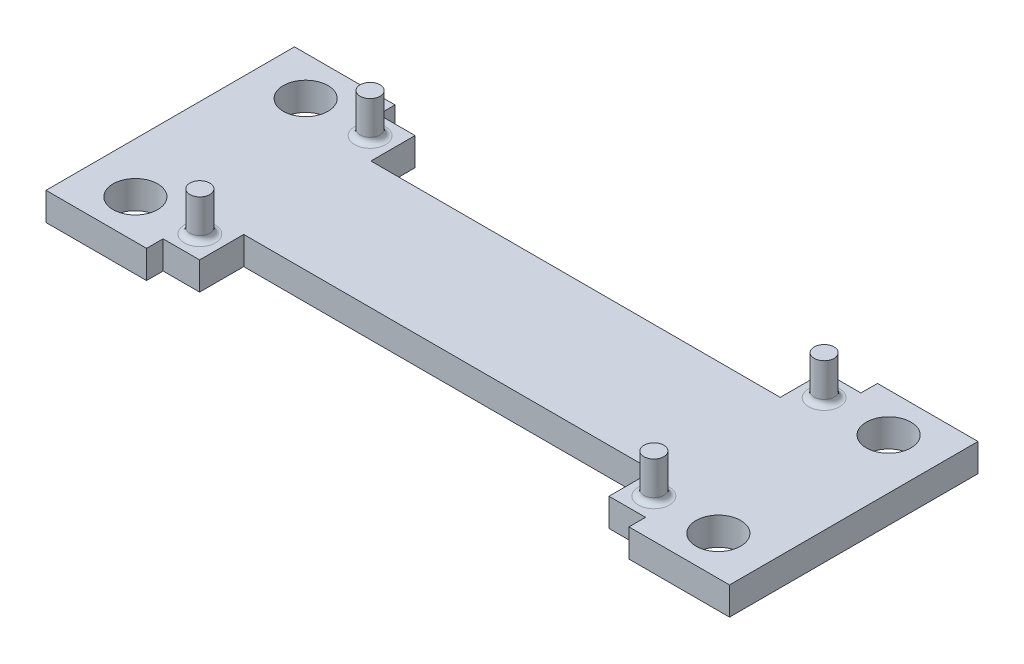
ISO-10303-21;
HEADER;
FILE_DESCRIPTION(('STEP AP214'),'2;1');
FILE_NAME('part.step','',(''),(''),'','','');
FILE_SCHEMA(('AUTOMOTIVE_DESIGN { 1 0 10303 214 1 1 1 1 }'));
ENDSEC;
DATA;
#1=APPLICATION_CONTEXT('core data for automotive mechanical design processes');
#2=APPLICATION_PROTOCOL_DEFINITION('international standard','automotive_design',2000,#1);
#3=PRODUCT_CONTEXT('',#1,'mechanical');
#4=PRODUCT('Part','Part','',(#3));
#5=PRODUCT_RELATED_PRODUCT_CATEGORY('part','',(#4));
#6=PRODUCT_DEFINITION_FORMATION('','',#4);
#7=PRODUCT_DEFINITION_CONTEXT('part definition',#1,'design');
#8=PRODUCT_DEFINITION('design','',#6,#7);
#9=PRODUCT_DEFINITION_SHAPE('','',#8);
#10=(LENGTH_UNIT() NAMED_UNIT(*) SI_UNIT(.MILLI.,.METRE.));
#11=(NAMED_UNIT(*) PLANE_ANGLE_UNIT() SI_UNIT($,.RADIAN.));
#12=(NAMED_UNIT(*) SI_UNIT($,.STERADIAN.) SOLID_ANGLE_UNIT());
#13=UNCERTAINTY_MEASURE_WITH_UNIT(LENGTH_MEASURE(1.E-05),#10,'distance_accuracy_value','');
#14=(GEOMETRIC_REPRESENTATION_CONTEXT(3) GLOBAL_UNCERTAINTY_ASSIGNED_CONTEXT((#13)) GLOBAL_UNIT_ASSIGNED_CONTEXT((#10,
#11,#12)) REPRESENTATION_CONTEXT('',''));
#15=CARTESIAN_POINT('',(0.,0.,0.));
#16=DIRECTION('',(0.,0.,1.));
#17=DIRECTION('',(1.,0.,0.));
#18=AXIS2_PLACEMENT_3D('',#15,#16,#17);
#19=CARTESIAN_POINT('',(0.,2.5,0.749999999999999));
#20=DIRECTION('',(0.,0.,-1.));
#21=DIRECTION('',(-1.,0.,0.));
#22=AXIS2_PLACEMENT_3D('',#19,#20,#21);
#23=PLANE('',#22);
#24=DIRECTION('',(1.,0.,0.));
#25=VECTOR('',#24,1.);
#26=CARTESIAN_POINT('',(0.,0.,0.749999999999999));
#27=LINE('',#26,#25);
#28=CARTESIAN_POINT('',(39.91,0.,0.75));
#29=VERTEX_POINT('',#28);
#30=CARTESIAN_POINT('',(43.18,0.,0.75));
#31=VERTEX_POINT('',#30);
#32=EDGE_CURVE('E219',#29,#31,#27,.T.);
#33=ORIENTED_EDGE('',*,*,#32,.T.);
#34=DIRECTION('',(0.,-1.,0.));
#35=VECTOR('',#34,1.);
#36=CARTESIAN_POINT('',(43.18,2.5,0.75));
#37=LINE('',#36,#35);
#38=CARTESIAN_POINT('',(43.18,2.5,0.75));
#39=VERTEX_POINT('',#38);
#40=EDGE_CURVE('E318',#39,#31,#37,.T.);
#41=ORIENTED_EDGE('',*,*,#40,.F.);
#42=DIRECTION('',(1.,0.,0.));
#43=VECTOR('',#42,1.);
#44=CARTESIAN_POINT('',(0.,2.5,0.749999999999999));
#45=LINE('',#44,#43);
#46=CARTESIAN_POINT('',(39.91,2.5,0.75));
#47=VERTEX_POINT('',#46);
#48=EDGE_CURVE('E282',#47,#39,#45,.T.);
#49=ORIENTED_EDGE('',*,*,#48,.F.);
#50=DIRECTION('',(0.,-1.,0.));
#51=VECTOR('',#50,1.);
#52=CARTESIAN_POINT('',(39.91,2.5,0.75));
#53=LINE('',#52,#51);
#54=EDGE_CURVE('E52',#47,#29,#53,.T.);
#55=ORIENTED_EDGE('',*,*,#54,.T.);
#56=EDGE_LOOP('',(#33,#41,#49,#55));
#57=FACE_BOUND('',#56,.T.);
#58=ADVANCED_FACE('F35',(#57),#23,.F.);
#59=CARTESIAN_POINT('',(43.18,2.5,0.));
#60=DIRECTION('',(1.,0.,0.));
#61=DIRECTION('',(0.,0.,-1.));
#62=AXIS2_PLACEMENT_3D('',#59,#60,#61);
#63=PLANE('',#62);
#64=DIRECTION('',(0.,0.,1.));
#65=VECTOR('',#64,1.);
#66=CARTESIAN_POINT('',(43.18,0.,0.));
#67=LINE('',#66,#65);
#68=CARTESIAN_POINT('',(43.18,0.,2.23));
#69=VERTEX_POINT('',#68);
#70=EDGE_CURVE('E221',#31,#69,#67,.T.);
#71=ORIENTED_EDGE('',*,*,#70,.T.);
#72=DIRECTION('',(0.,-1.,0.));
#73=VECTOR('',#72,1.);
#74=CARTESIAN_POINT('',(43.18,2.5,2.23));
#75=LINE('',#74,#73);
#76=CARTESIAN_POINT('',(43.18,2.5,2.23));
#77=VERTEX_POINT('',#76);
#78=EDGE_CURVE('E315',#77,#69,#75,.T.);
#79=ORIENTED_EDGE('',*,*,#78,.F.);
#80=DIRECTION('',(0.,0.,1.));
#81=VECTOR('',#80,1.);
#82=CARTESIAN_POINT('',(43.18,2.5,0.));
#83=LINE('',#82,#81);
#84=EDGE_CURVE('E128',#39,#77,#83,.T.);
#85=ORIENTED_EDGE('',*,*,#84,.F.);
#86=ORIENTED_EDGE('',*,*,#40,.T.);
#87=EDGE_LOOP('',(#71,#79,#85,#86));
#88=FACE_BOUND('',#87,.T.);
#89=ADVANCED_FACE('F357',(#88),#63,.F.);
#90=CARTESIAN_POINT('',(0.,2.5,2.23));
#91=DIRECTION('',(0.,0.,-1.));
#92=DIRECTION('',(-1.,0.,0.));
#93=AXIS2_PLACEMENT_3D('',#90,#91,#92);
#94=PLANE('',#93);
#95=DIRECTION('',(1.,0.,0.));
#96=VECTOR('',#95,1.);
#97=CARTESIAN_POINT('',(0.,0.,2.23));
#98=LINE('',#97,#96);
#99=CARTESIAN_POINT('',(52.18,0.,2.23));
#100=VERTEX_POINT('',#99);
#101=EDGE_CURVE('E224',#69,#100,#98,.T.);
#102=ORIENTED_EDGE('',*,*,#101,.T.);
#103=DIRECTION('',(0.,-1.,0.));
#104=VECTOR('',#103,1.);
#105=CARTESIAN_POINT('',(52.18,2.5,2.23));
#106=LINE('',#105,#104);
#107=CARTESIAN_POINT('',(52.18,2.5,2.23));
#108=VERTEX_POINT('',#107);
#109=EDGE_CURVE('E313',#108,#100,#106,.T.);
#110=ORIENTED_EDGE('',*,*,#109,.F.);
#111=DIRECTION('',(1.,0.,0.));
#112=VECTOR('',#111,1.);
#113=CARTESIAN_POINT('',(0.,2.5,2.23));
#114=LINE('',#113,#112);
#115=EDGE_CURVE('E400',#77,#108,#114,.T.);
#116=ORIENTED_EDGE('',*,*,#115,.F.);
#117=ORIENTED_EDGE('',*,*,#78,.T.);
#118=EDGE_LOOP('',(#102,#110,#116,#117));
#119=FACE_BOUND('',#118,.T.);
#120=ADVANCED_FACE('F362',(#119),#94,.F.);
#121=CARTESIAN_POINT('',(52.18,2.5,0.));
#122=DIRECTION('',(1.,0.,0.));
#123=DIRECTION('',(0.,0.,-1.));
#124=AXIS2_PLACEMENT_3D('',#121,#122,#123);
#125=PLANE('',#124);
#126=DIRECTION('',(0.,0.,1.));
#127=VECTOR('',#126,1.);
#128=CARTESIAN_POINT('',(52.18,0.,0.));
#129=LINE('',#128,#127);
#130=CARTESIAN_POINT('',(52.18,0.,-20.01));
#131=VERTEX_POINT('',#130);
#132=EDGE_CURVE('E228',#131,#100,#129,.T.);
#133=ORIENTED_EDGE('',*,*,#132,.F.);
#134=DIRECTION('',(0.,-1.,0.));
#135=VECTOR('',#134,1.);
#136=CARTESIAN_POINT('',(52.18,2.5,-20.01));
#137=LINE('',#136,#135);
#138=CARTESIAN_POINT('',(52.18,2.5,-20.01));
#139=VERTEX_POINT('',#138);
#140=EDGE_CURVE('E311',#139,#131,#137,.T.);
#141=ORIENTED_EDGE('',*,*,#140,.F.);
#142=DIRECTION('',(0.,0.,1.));
#143=VECTOR('',#142,1.);
#144=CARTESIAN_POINT('',(52.18,2.5,0.));
#145=LINE('',#144,#143);
#146=EDGE_CURVE('E403',#139,#108,#145,.T.);
#147=ORIENTED_EDGE('',*,*,#146,.T.);
#148=ORIENTED_EDGE('',*,*,#109,.T.);
#149=EDGE_LOOP('',(#133,#141,#147,#148));
#150=FACE_BOUND('',#149,.T.);
#151=ADVANCED_FACE('F495',(#150),#125,.T.);
#152=CARTESIAN_POINT('',(0.,2.5,-20.01));
#153=DIRECTION('',(0.,0.,-1.));
#154=DIRECTION('',(-1.,0.,0.));
#155=AXIS2_PLACEMENT_3D('',#152,#153,#154);
#156=PLANE('',#155);
#157=DIRECTION('',(1.,0.,0.));
#158=VECTOR('',#157,1.);
#159=CARTESIAN_POINT('',(0.,0.,-20.01));
#160=LINE('',#159,#158);
#161=CARTESIAN_POINT('',(43.18,0.,-20.01));
#162=VERTEX_POINT('',#161);
#163=EDGE_CURVE('E231',#162,#131,#160,.T.);
#164=ORIENTED_EDGE('',*,*,#163,.F.);
#165=DIRECTION('',(0.,-1.,0.));
#166=VECTOR('',#165,1.);
#167=CARTESIAN_POINT('',(43.18,2.5,-20.01));
#168=LINE('',#167,#166);
#169=CARTESIAN_POINT('',(43.18,2.5,-20.01));
#170=VERTEX_POINT('',#169);
#171=EDGE_CURVE('E309',#170,#162,#168,.T.);
#172=ORIENTED_EDGE('',*,*,#171,.F.);
#173=DIRECTION('',(1.,0.,0.));
#174=VECTOR('',#173,1.);
#175=CARTESIAN_POINT('',(0.,2.5,-20.01));
#176=LINE('',#175,#174);
#177=EDGE_CURVE('E406',#170,#139,#176,.T.);
#178=ORIENTED_EDGE('',*,*,#177,.T.);
#179=ORIENTED_EDGE('',*,*,#140,.T.);
#180=EDGE_LOOP('',(#164,#172,#178,#179));
#181=FACE_BOUND('',#180,.T.);
#182=ADVANCED_FACE('F492',(#181),#156,.T.);
#183=CARTESIAN_POINT('',(43.18,0.,-18.53));
#184=VERTEX_POINT('',#183);
#185=EDGE_CURVE('E225',#162,#184,#67,.T.);
#186=ORIENTED_EDGE('',*,*,#185,.T.);
#187=DIRECTION('',(0.,-1.,0.));
#188=VECTOR('',#187,1.);
#189=CARTESIAN_POINT('',(43.18,2.5,-18.53));
#190=LINE('',#189,#188);
#191=CARTESIAN_POINT('',(43.18,2.5,-18.53));
#192=VERTEX_POINT('',#191);
#193=EDGE_CURVE('E307',#192,#184,#190,.T.);
#194=ORIENTED_EDGE('',*,*,#193,.F.);
#195=EDGE_CURVE('E401',#170,#192,#83,.T.);
#196=ORIENTED_EDGE('',*,*,#195,.F.);
#197=ORIENTED_EDGE('',*,*,#171,.T.);
#198=EDGE_LOOP('',(#186,#194,#196,#197));
#199=FACE_BOUND('',#198,.T.);
#200=ADVANCED_FACE('F364',(#199),#63,.F.);
#201=CARTESIAN_POINT('',(0.,2.5,-18.53));
#202=DIRECTION('',(0.,0.,-1.));
#203=DIRECTION('',(-1.,0.,0.));
#204=AXIS2_PLACEMENT_3D('',#201,#202,#203);
#205=PLANE('',#204);
#206=DIRECTION('',(1.,0.,0.));
#207=VECTOR('',#206,1.);
#208=CARTESIAN_POINT('',(0.,0.,-18.53));
#209=LINE('',#208,#207);
#210=CARTESIAN_POINT('',(39.91,0.,-18.53));
#211=VERTEX_POINT('',#210);
#212=EDGE_CURVE('E234',#211,#184,#209,.T.);
#213=ORIENTED_EDGE('',*,*,#212,.F.);
#214=DIRECTION('',(0.,-1.,0.));
#215=VECTOR('',#214,1.);
#216=CARTESIAN_POINT('',(39.91,2.5,-18.53));
#217=LINE('',#216,#215);
#218=CARTESIAN_POINT('',(39.91,2.5,-18.53));
#219=VERTEX_POINT('',#218);
#220=EDGE_CURVE('E305',#219,#211,#217,.T.);
#221=ORIENTED_EDGE('',*,*,#220,.F.);
#222=DIRECTION('',(1.,0.,0.));
#223=VECTOR('',#222,1.);
#224=CARTESIAN_POINT('',(0.,2.5,-18.53));
#225=LINE('',#224,#223);
#226=EDGE_CURVE('E409',#219,#192,#225,.T.);
#227=ORIENTED_EDGE('',*,*,#226,.T.);
#228=ORIENTED_EDGE('',*,*,#193,.T.);
#229=EDGE_LOOP('',(#213,#221,#227,#228));
#230=FACE_BOUND('',#229,.T.);
#231=ADVANCED_FACE('F486',(#230),#205,.T.);
#232=CARTESIAN_POINT('',(39.91,2.5,0.));
#233=DIRECTION('',(1.,0.,0.));
#234=DIRECTION('',(0.,0.,-1.));
#235=AXIS2_PLACEMENT_3D('',#232,#233,#234);
#236=PLANE('',#235);
#237=DIRECTION('',(0.,0.,1.));
#238=VECTOR('',#237,1.);
#239=CARTESIAN_POINT('',(39.91,0.,0.));
#240=LINE('',#239,#238);
#241=CARTESIAN_POINT('',(39.91,0.,-14.58));
#242=VERTEX_POINT('',#241);
#243=EDGE_CURVE('E237',#211,#242,#240,.T.);
#244=ORIENTED_EDGE('',*,*,#243,.T.);
#245=DIRECTION('',(0.,-1.,0.));
#246=VECTOR('',#245,1.);
#247=CARTESIAN_POINT('',(39.91,2.5,-14.58));
#248=LINE('',#247,#246);
#249=CARTESIAN_POINT('',(39.91,2.5,-14.58));
#250=VERTEX_POINT('',#249);
#251=EDGE_CURVE('E303',#250,#242,#248,.T.);
#252=ORIENTED_EDGE('',*,*,#251,.F.);
#253=DIRECTION('',(0.,0.,1.));
#254=VECTOR('',#253,1.);
#255=CARTESIAN_POINT('',(39.91,2.5,0.));
#256=LINE('',#255,#254);
#257=EDGE_CURVE('E412',#219,#250,#256,.T.);
#258=ORIENTED_EDGE('',*,*,#257,.F.);
#259=ORIENTED_EDGE('',*,*,#220,.T.);
#260=EDGE_LOOP('',(#244,#252,#258,#259));
#261=FACE_BOUND('',#260,.T.);
#262=ADVANCED_FACE('F482',(#261),#236,.F.);
#263=CARTESIAN_POINT('',(0.,2.5,-14.58));
#264=DIRECTION('',(0.,0.,-1.));
#265=DIRECTION('',(-1.,0.,0.));
#266=AXIS2_PLACEMENT_3D('',#263,#264,#265);
#267=PLANE('',#266);
#268=DIRECTION('',(1.,0.,0.));
#269=VECTOR('',#268,1.);
#270=CARTESIAN_POINT('',(0.,0.,-14.58));
#271=LINE('',#270,#269);
#272=CARTESIAN_POINT('',(3.27,0.,-14.58));
#273=VERTEX_POINT('',#272);
#274=EDGE_CURVE('E240',#273,#242,#271,.T.);
#275=ORIENTED_EDGE('',*,*,#274,.F.);
#276=DIRECTION('',(0.,-1.,0.));
#277=VECTOR('',#276,1.);
#278=CARTESIAN_POINT('',(3.27,2.5,-14.58));
#279=LINE('',#278,#277);
#280=CARTESIAN_POINT('',(3.27,2.5,-14.58));
#281=VERTEX_POINT('',#280);
#282=EDGE_CURVE('E301',#281,#273,#279,.T.);
#283=ORIENTED_EDGE('',*,*,#282,.F.);
#284=DIRECTION('',(1.,0.,0.));
#285=VECTOR('',#284,1.);
#286=CARTESIAN_POINT('',(0.,2.5,-14.58));
#287=LINE('',#286,#285);
#288=EDGE_CURVE('E414',#281,#250,#287,.T.);
#289=ORIENTED_EDGE('',*,*,#288,.T.);
#290=ORIENTED_EDGE('',*,*,#251,.T.);
#291=EDGE_LOOP('',(#275,#283,#289,#290));
#292=FACE_BOUND('',#291,.T.);
#293=ADVANCED_FACE('F478',(#292),#267,.T.);
#294=CARTESIAN_POINT('',(3.27,2.5,0.));
#295=DIRECTION('',(1.,0.,0.));
#296=DIRECTION('',(0.,0.,-1.));
#297=AXIS2_PLACEMENT_3D('',#294,#295,#296);
#298=PLANE('',#297);
#299=DIRECTION('',(0.,0.,1.));
#300=VECTOR('',#299,1.);
#301=CARTESIAN_POINT('',(3.27,0.,0.));
#302=LINE('',#301,#300);
#303=CARTESIAN_POINT('',(3.27,0.,-18.53));
#304=VERTEX_POINT('',#303);
#305=EDGE_CURVE('E243',#304,#273,#302,.T.);
#306=ORIENTED_EDGE('',*,*,#305,.F.);
#307=DIRECTION('',(0.,-1.,0.));
#308=VECTOR('',#307,1.);
#309=CARTESIAN_POINT('',(3.27,2.5,-18.53));
#310=LINE('',#309,#308);
#311=CARTESIAN_POINT('',(3.27,2.5,-18.53));
#312=VERTEX_POINT('',#311);
#313=EDGE_CURVE('E299',#312,#304,#310,.T.);
#314=ORIENTED_EDGE('',*,*,#313,.F.);
#315=DIRECTION('',(0.,0.,1.));
#316=VECTOR('',#315,1.);
#317=CARTESIAN_POINT('',(3.27,2.5,0.));
#318=LINE('',#317,#316);
#319=EDGE_CURVE('E417',#312,#281,#318,.T.);
#320=ORIENTED_EDGE('',*,*,#319,.T.);
#321=ORIENTED_EDGE('',*,*,#282,.T.);
#322=EDGE_LOOP('',(#306,#314,#320,#321));
#323=FACE_BOUND('',#322,.T.);
#324=ADVANCED_FACE('F474',(#323),#298,.T.);
#325=CARTESIAN_POINT('',(0.,2.5,-18.53));
#326=DIRECTION('',(0.,0.,1.));
#327=DIRECTION('',(1.,0.,0.));
#328=AXIS2_PLACEMENT_3D('',#325,#326,#327);
#329=PLANE('',#328);
#330=DIRECTION('',(-1.,0.,0.));
#331=VECTOR('',#330,1.);
#332=CARTESIAN_POINT('',(0.,0.,-18.53));
#333=LINE('',#332,#331);
#334=CARTESIAN_POINT('',(0.,0.,-18.53));
#335=VERTEX_POINT('',#334);
#336=EDGE_CURVE('E246',#304,#335,#333,.T.);
#337=ORIENTED_EDGE('',*,*,#336,.T.);
#338=DIRECTION('',(0.,-1.,0.));
#339=VECTOR('',#338,1.);
#340=CARTESIAN_POINT('',(0.,2.5,-18.53));
#341=LINE('',#340,#339);
#342=CARTESIAN_POINT('',(0.,2.5,-18.53));
#343=VERTEX_POINT('',#342);
#344=EDGE_CURVE('E297',#343,#335,#341,.T.);
#345=ORIENTED_EDGE('',*,*,#344,.F.);
#346=DIRECTION('',(-1.,0.,0.));
#347=VECTOR('',#346,1.);
#348=CARTESIAN_POINT('',(0.,2.5,-18.53));
#349=LINE('',#348,#347);
#350=EDGE_CURVE('E420',#312,#343,#349,.T.);
#351=ORIENTED_EDGE('',*,*,#350,.F.);
#352=ORIENTED_EDGE('',*,*,#313,.T.);
#353=EDGE_LOOP('',(#337,#345,#351,#352));
#354=FACE_BOUND('',#353,.T.);
#355=ADVANCED_FACE('F471',(#354),#329,.F.);
#356=CARTESIAN_POINT('',(0.,2.5,0.));
#357=DIRECTION('',(1.,0.,0.));
#358=DIRECTION('',(0.,0.,-1.));
#359=AXIS2_PLACEMENT_3D('',#356,#357,#358);
#360=PLANE('',#359);
#361=DIRECTION('',(0.,0.,1.));
#362=VECTOR('',#361,1.);
#363=CARTESIAN_POINT('',(0.,0.,0.));
#364=LINE('',#363,#362);
#365=CARTESIAN_POINT('',(0.,0.,-20.01));
#366=VERTEX_POINT('',#365);
#367=EDGE_CURVE('E249',#366,#335,#364,.T.);
#368=ORIENTED_EDGE('',*,*,#367,.F.);
#369=DIRECTION('',(0.,-1.,0.));
#370=VECTOR('',#369,1.);
#371=CARTESIAN_POINT('',(0.,2.5,-20.01));
#372=LINE('',#371,#370);
#373=CARTESIAN_POINT('',(0.,2.5,-20.01));
#374=VERTEX_POINT('',#373);
#375=EDGE_CURVE('E295',#374,#366,#372,.T.);
#376=ORIENTED_EDGE('',*,*,#375,.F.);
#377=DIRECTION('',(0.,0.,1.));
#378=VECTOR('',#377,1.);
#379=CARTESIAN_POINT('',(0.,2.5,0.));
#380=LINE('',#379,#378);
#381=EDGE_CURVE('E422',#374,#343,#380,.T.);
#382=ORIENTED_EDGE('',*,*,#381,.T.);
#383=ORIENTED_EDGE('',*,*,#344,.T.);
#384=EDGE_LOOP('',(#368,#376,#382,#383));
#385=FACE_BOUND('',#384,.T.);
#386=ADVANCED_FACE('F458',(#385),#360,.T.);
#387=CARTESIAN_POINT('',(0.,2.5,-20.01));
#388=DIRECTION('',(0.,0.,1.));
#389=DIRECTION('',(1.,0.,0.));
#390=AXIS2_PLACEMENT_3D('',#387,#388,#389);
#391=PLANE('',#390);
#392=DIRECTION('',(-1.,0.,0.));
#393=VECTOR('',#392,1.);
#394=CARTESIAN_POINT('',(0.,0.,-20.01));
#395=LINE('',#394,#393);
#396=CARTESIAN_POINT('',(-9.,0.,-20.01));
#397=VERTEX_POINT('',#396);
#398=EDGE_CURVE('E252',#366,#397,#395,.T.);
#399=ORIENTED_EDGE('',*,*,#398,.T.);
#400=DIRECTION('',(0.,-1.,0.));
#401=VECTOR('',#400,1.);
#402=CARTESIAN_POINT('',(-9.,2.5,-20.01));
#403=LINE('',#402,#401);
#404=CARTESIAN_POINT('',(-9.,2.5,-20.01));
#405=VERTEX_POINT('',#404);
#406=EDGE_CURVE('E292',#405,#397,#403,.T.);
#407=ORIENTED_EDGE('',*,*,#406,.F.);
#408=DIRECTION('',(-1.,0.,0.));
#409=VECTOR('',#408,1.);
#410=CARTESIAN_POINT('',(0.,2.5,-20.01));
#411=LINE('',#410,#409);
#412=EDGE_CURVE('E425',#374,#405,#411,.T.);
#413=ORIENTED_EDGE('',*,*,#412,.F.);
#414=ORIENTED_EDGE('',*,*,#375,.T.);
#415=EDGE_LOOP('',(#399,#407,#413,#414));
#416=FACE_BOUND('',#415,.T.);
#417=ADVANCED_FACE('F466',(#416),#391,.F.);
#418=CARTESIAN_POINT('',(-9.,2.5,0.));
#419=DIRECTION('',(1.,0.,0.));
#420=DIRECTION('',(0.,0.,-1.));
#421=AXIS2_PLACEMENT_3D('',#418,#419,#420);
#422=PLANE('',#421);
#423=DIRECTION('',(0.,0.,1.));
#424=VECTOR('',#423,1.);
#425=CARTESIAN_POINT('',(-9.,0.,0.));
#426=LINE('',#425,#424);
#427=CARTESIAN_POINT('',(-9.,0.,2.23));
#428=VERTEX_POINT('',#427);
#429=EDGE_CURVE('E255',#397,#428,#426,.T.);
#430=ORIENTED_EDGE('',*,*,#429,.T.);
#431=DIRECTION('',(0.,-1.,0.));
#432=VECTOR('',#431,1.);
#433=CARTESIAN_POINT('',(-9.,2.5,2.23));
#434=LINE('',#433,#432);
#435=CARTESIAN_POINT('',(-9.,2.5,2.23));
#436=VERTEX_POINT('',#435);
#437=EDGE_CURVE('E290',#436,#428,#434,.T.);
#438=ORIENTED_EDGE('',*,*,#437,.F.);
#439=DIRECTION('',(0.,0.,1.));
#440=VECTOR('',#439,1.);
#441=CARTESIAN_POINT('',(-9.,2.5,0.));
#442=LINE('',#441,#440);
#443=EDGE_CURVE('E428',#405,#436,#442,.T.);
#444=ORIENTED_EDGE('',*,*,#443,.F.);
#445=ORIENTED_EDGE('',*,*,#406,.T.);
#446=EDGE_LOOP('',(#430,#438,#444,#445));
#447=FACE_BOUND('',#446,.T.);
#448=ADVANCED_FACE('F463',(#447),#422,.F.);
#449=CARTESIAN_POINT('',(0.,2.5,2.23));
#450=DIRECTION('',(0.,0.,1.));
#451=DIRECTION('',(1.,0.,0.));
#452=AXIS2_PLACEMENT_3D('',#449,#450,#451);
#453=PLANE('',#452);
#454=DIRECTION('',(-1.,0.,0.));
#455=VECTOR('',#454,1.);
#456=CARTESIAN_POINT('',(0.,0.,2.23));
#457=LINE('',#456,#455);
#458=CARTESIAN_POINT('',(0.,0.,2.23));
#459=VERTEX_POINT('',#458);
#460=EDGE_CURVE('E258',#459,#428,#457,.T.);
#461=ORIENTED_EDGE('',*,*,#460,.F.);
#462=DIRECTION('',(0.,-1.,0.));
#463=VECTOR('',#462,1.);
#464=CARTESIAN_POINT('',(0.,2.5,2.23));
#465=LINE('',#464,#463);
#466=CARTESIAN_POINT('',(0.,2.5,2.23));
#467=VERTEX_POINT('',#466);
#468=EDGE_CURVE('E288',#467,#459,#465,.T.);
#469=ORIENTED_EDGE('',*,*,#468,.F.);
#470=DIRECTION('',(-1.,0.,0.));
#471=VECTOR('',#470,1.);
#472=CARTESIAN_POINT('',(0.,2.5,2.23));
#473=LINE('',#472,#471);
#474=EDGE_CURVE('E430',#467,#436,#473,.T.);
#475=ORIENTED_EDGE('',*,*,#474,.T.);
#476=ORIENTED_EDGE('',*,*,#437,.T.);
#477=EDGE_LOOP('',(#461,#469,#475,#476));
#478=FACE_BOUND('',#477,.T.);
#479=ADVANCED_FACE('F442',(#478),#453,.T.);
#480=CARTESIAN_POINT('',(0.,0.,0.75));
#481=VERTEX_POINT('',#480);
#482=EDGE_CURVE('E253',#481,#459,#364,.T.);
#483=ORIENTED_EDGE('',*,*,#482,.F.);
#484=DIRECTION('',(0.,-1.,0.));
#485=VECTOR('',#484,1.);
#486=CARTESIAN_POINT('',(0.,2.5,0.75));
#487=LINE('',#486,#485);
#488=CARTESIAN_POINT('',(0.,2.5,0.75));
#489=VERTEX_POINT('',#488);
#490=EDGE_CURVE('E286',#489,#481,#487,.T.);
#491=ORIENTED_EDGE('',*,*,#490,.F.);
#492=EDGE_CURVE('E426',#489,#467,#380,.T.);
#493=ORIENTED_EDGE('',*,*,#492,.T.);
#494=ORIENTED_EDGE('',*,*,#468,.T.);
#495=EDGE_LOOP('',(#483,#491,#493,#494));
#496=FACE_BOUND('',#495,.T.);
#497=ADVANCED_FACE('F436',(#496),#360,.T.);
#498=CARTESIAN_POINT('',(0.,2.5,0.75));
#499=DIRECTION('',(0.,0.,1.));
#500=DIRECTION('',(1.,0.,0.));
#501=AXIS2_PLACEMENT_3D('',#498,#499,#500);
#502=PLANE('',#501);
#503=DIRECTION('',(-1.,0.,0.));
#504=VECTOR('',#503,1.);
#505=CARTESIAN_POINT('',(0.,0.,0.75));
#506=LINE('',#505,#504);
#507=CARTESIAN_POINT('',(3.27,0.,0.75));
#508=VERTEX_POINT('',#507);
#509=EDGE_CURVE('E261',#508,#481,#506,.T.);
#510=ORIENTED_EDGE('',*,*,#509,.F.);
#511=DIRECTION('',(0.,-1.,0.));
#512=VECTOR('',#511,1.);
#513=CARTESIAN_POINT('',(3.27,2.5,0.75));
#514=LINE('',#513,#512);
#515=CARTESIAN_POINT('',(3.27,2.5,0.75));
#516=VERTEX_POINT('',#515);
#517=EDGE_CURVE('E199',#516,#508,#514,.T.);
#518=ORIENTED_EDGE('',*,*,#517,.F.);
#519=DIRECTION('',(-1.,0.,0.));
#520=VECTOR('',#519,1.);
#521=CARTESIAN_POINT('',(0.,2.5,0.75));
#522=LINE('',#521,#520);
#523=EDGE_CURVE('E189',#516,#489,#522,.T.);
#524=ORIENTED_EDGE('',*,*,#523,.T.);
#525=ORIENTED_EDGE('',*,*,#490,.T.);
#526=EDGE_LOOP('',(#510,#518,#524,#525));
#527=FACE_BOUND('',#526,.T.);
#528=ADVANCED_FACE('F449',(#527),#502,.T.);
#529=CARTESIAN_POINT('',(3.27,2.5,0.));
#530=DIRECTION('',(-1.,0.,0.));
#531=DIRECTION('',(0.,0.,1.));
#532=AXIS2_PLACEMENT_3D('',#529,#530,#531);
#533=PLANE('',#532);
#534=DIRECTION('',(0.,0.,-1.));
#535=VECTOR('',#534,1.);
#536=CARTESIAN_POINT('',(3.27,0.,0.));
#537=LINE('',#536,#535);
#538=CARTESIAN_POINT('',(3.27,0.,-3.2));
#539=VERTEX_POINT('',#538);
#540=EDGE_CURVE('E196',#508,#539,#537,.T.);
#541=ORIENTED_EDGE('',*,*,#540,.T.);
#542=DIRECTION('',(0.,-1.,0.));
#543=VECTOR('',#542,1.);
#544=CARTESIAN_POINT('',(3.27,2.5,-3.2));
#545=LINE('',#544,#543);
#546=CARTESIAN_POINT('',(3.27,2.5,-3.2));
#547=VERTEX_POINT('',#546);
#548=EDGE_CURVE('E193',#547,#539,#545,.T.);
#549=ORIENTED_EDGE('',*,*,#548,.F.);
#550=DIRECTION('',(0.,0.,-1.));
#551=VECTOR('',#550,1.);
#552=CARTESIAN_POINT('',(3.27,2.5,0.));
#553=LINE('',#552,#551);
#554=EDGE_CURVE('E180',#516,#547,#553,.T.);
#555=ORIENTED_EDGE('',*,*,#554,.F.);
#556=ORIENTED_EDGE('',*,*,#517,.T.);
#557=EDGE_LOOP('',(#541,#549,#555,#556));
#558=FACE_BOUND('',#557,.T.);
#559=ADVANCED_FACE('F194',(#558),#533,.F.);
#560=CARTESIAN_POINT('',(0.,2.5,-3.2));
#561=DIRECTION('',(0.,0.,-1.));
#562=DIRECTION('',(-1.,0.,0.));
#563=AXIS2_PLACEMENT_3D('',#560,#561,#562);
#564=PLANE('',#563);
#565=DIRECTION('',(1.,0.,0.));
#566=VECTOR('',#565,1.);
#567=CARTESIAN_POINT('',(0.,0.,-3.2));
#568=LINE('',#567,#566);
#569=CARTESIAN_POINT('',(39.91,0.,-3.2));
#570=VERTEX_POINT('',#569);
#571=EDGE_CURVE('E265',#539,#570,#568,.T.);
#572=ORIENTED_EDGE('',*,*,#571,.T.);
#573=DIRECTION('',(0.,-1.,0.));
#574=VECTOR('',#573,1.);
#575=CARTESIAN_POINT('',(39.91,2.5,-3.2));
#576=LINE('',#575,#574);
#577=CARTESIAN_POINT('',(39.91,2.5,-3.2));
#578=VERTEX_POINT('',#577);
#579=EDGE_CURVE('E115',#578,#570,#576,.T.);
#580=ORIENTED_EDGE('',*,*,#579,.F.);
#581=DIRECTION('',(1.,0.,0.));
#582=VECTOR('',#581,1.);
#583=CARTESIAN_POINT('',(0.,2.5,-3.2));
#584=LINE('',#583,#582);
#585=EDGE_CURVE('E186',#547,#578,#584,.T.);
#586=ORIENTED_EDGE('',*,*,#585,.F.);
#587=ORIENTED_EDGE('',*,*,#548,.T.);
#588=EDGE_LOOP('',(#572,#580,#586,#587));
#589=FACE_BOUND('',#588,.T.);
#590=ADVANCED_FACE('F201',(#589),#564,.F.);
#591=CARTESIAN_POINT('',(47.68,2.5,-16.51));
#592=DIRECTION('',(0.,-1.,0.));
#593=DIRECTION('',(0.,0.,-1.));
#594=AXIS2_PLACEMENT_3D('',#591,#592,#593);
#595=CYLINDRICAL_SURFACE('',#594,2.);
#596=CARTESIAN_POINT('',(47.68,2.5,-16.51));
#597=DIRECTION('',(0.,1.,0.));
#598=DIRECTION('',(0.,0.,1.));
#599=AXIS2_PLACEMENT_3D('',#596,#597,#598);
#600=CIRCLE('',#599,2.);
#601=CARTESIAN_POINT('',(47.68,2.5,-14.51));
#602=VERTEX_POINT('',#601);
#603=EDGE_CURVE('E213',#602,#602,#600,.T.);
#604=ORIENTED_EDGE('',*,*,#603,.T.);
#605=EDGE_LOOP('',(#604));
#606=FACE_BOUND('',#605,.T.);
#607=CARTESIAN_POINT('',(47.68,0.,-16.51));
#608=DIRECTION('',(0.,1.,0.));
#609=DIRECTION('',(0.,0.,1.));
#610=AXIS2_PLACEMENT_3D('',#607,#608,#609);
#611=CIRCLE('',#610,2.);
#612=CARTESIAN_POINT('',(47.68,0.,-14.51));
#613=VERTEX_POINT('',#612);
#614=EDGE_CURVE('E276',#613,#613,#611,.T.);
#615=ORIENTED_EDGE('',*,*,#614,.F.);
#616=EDGE_LOOP('',(#615));
#617=FACE_BOUND('',#616,.T.);
#618=ADVANCED_FACE('F532',(#606,#617),#595,.F.);
#619=CARTESIAN_POINT('',(-4.5,2.5,-16.51));
#620=DIRECTION('',(0.,-1.,0.));
#621=DIRECTION('',(0.,0.,-1.));
#622=AXIS2_PLACEMENT_3D('',#619,#620,#621);
#623=CYLINDRICAL_SURFACE('',#622,2.);
#624=CARTESIAN_POINT('',(-4.5,2.5,-16.51));
#625=DIRECTION('',(0.,1.,0.));
#626=DIRECTION('',(0.,0.,1.));
#627=AXIS2_PLACEMENT_3D('',#624,#625,#626);
#628=CIRCLE('',#627,2.);
#629=CARTESIAN_POINT('',(-4.5,2.5,-14.51));
#630=VERTEX_POINT('',#629);
#631=EDGE_CURVE('E210',#630,#630,#628,.T.);
#632=ORIENTED_EDGE('',*,*,#631,.T.);
#633=EDGE_LOOP('',(#632));
#634=FACE_BOUND('',#633,.T.);
#635=CARTESIAN_POINT('',(-4.5,0.,-16.51));
#636=DIRECTION('',(0.,1.,0.));
#637=DIRECTION('',(0.,0.,1.));
#638=AXIS2_PLACEMENT_3D('',#635,#636,#637);
#639=CIRCLE('',#638,2.);
#640=CARTESIAN_POINT('',(-4.5,0.,-14.51));
#641=VERTEX_POINT('',#640);
#642=EDGE_CURVE('E273',#641,#641,#639,.T.);
#643=ORIENTED_EDGE('',*,*,#642,.F.);
#644=EDGE_LOOP('',(#643));
#645=FACE_BOUND('',#644,.T.);
#646=ADVANCED_FACE('F527',(#634,#645),#623,.F.);
#647=CARTESIAN_POINT('',(-4.5,2.5,-1.27));
#648=DIRECTION('',(0.,-1.,0.));
#649=DIRECTION('',(0.,0.,-1.));
#650=AXIS2_PLACEMENT_3D('',#647,#648,#649);
#651=CYLINDRICAL_SURFACE('',#650,2.);
#652=CARTESIAN_POINT('',(-4.5,2.5,-1.27));
#653=DIRECTION('',(0.,1.,0.));
#654=DIRECTION('',(0.,0.,1.));
#655=AXIS2_PLACEMENT_3D('',#652,#653,#654);
#656=CIRCLE('',#655,2.);
#657=CARTESIAN_POINT('',(-4.5,2.5,0.73));
#658=VERTEX_POINT('',#657);
#659=EDGE_CURVE('E204',#658,#658,#656,.T.);
#660=ORIENTED_EDGE('',*,*,#659,.T.);
#661=EDGE_LOOP('',(#660));
#662=FACE_BOUND('',#661,.T.);
#663=CARTESIAN_POINT('',(-4.5,0.,-1.27));
#664=DIRECTION('',(0.,1.,0.));
#665=DIRECTION('',(0.,0.,1.));
#666=AXIS2_PLACEMENT_3D('',#663,#664,#665);
#667=CIRCLE('',#666,2.);
#668=CARTESIAN_POINT('',(-4.5,0.,0.73));
#669=VERTEX_POINT('',#668);
#670=EDGE_CURVE('E270',#669,#669,#667,.T.);
#671=ORIENTED_EDGE('',*,*,#670,.F.);
#672=EDGE_LOOP('',(#671));
#673=FACE_BOUND('',#672,.T.);
#674=ADVANCED_FACE('F519',(#662,#673),#651,.F.);
#675=CARTESIAN_POINT('',(39.91,2.5,0.));
#676=DIRECTION('',(-1.,0.,0.));
#677=DIRECTION('',(0.,0.,1.));
#678=AXIS2_PLACEMENT_3D('',#675,#676,#677);
#679=PLANE('',#678);
#680=DIRECTION('',(0.,0.,-1.));
#681=VECTOR('',#680,1.);
#682=CARTESIAN_POINT('',(39.91,0.,0.));
#683=LINE('',#682,#681);
#684=EDGE_CURVE('E267',#29,#570,#683,.T.);
#685=ORIENTED_EDGE('',*,*,#684,.F.);
#686=ORIENTED_EDGE('',*,*,#54,.F.);
#687=DIRECTION('',(0.,0.,-1.));
#688=VECTOR('',#687,1.);
#689=CARTESIAN_POINT('',(39.91,2.5,0.));
#690=LINE('',#689,#688);
#691=EDGE_CURVE('E202',#47,#578,#690,.T.);
#692=ORIENTED_EDGE('',*,*,#691,.T.);
#693=ORIENTED_EDGE('',*,*,#579,.T.);
#694=EDGE_LOOP('',(#685,#686,#692,#693));
#695=FACE_BOUND('',#694,.T.);
#696=ADVANCED_FACE('F516',(#695),#679,.T.);
#697=CARTESIAN_POINT('',(47.68,2.5,-1.27));
#698=DIRECTION('',(0.,-1.,0.));
#699=DIRECTION('',(0.,0.,-1.));
#700=AXIS2_PLACEMENT_3D('',#697,#698,#699);
#701=CYLINDRICAL_SURFACE('',#700,2.);
#702=CARTESIAN_POINT('',(47.68,2.5,-1.27));
#703=DIRECTION('',(0.,1.,0.));
#704=DIRECTION('',(0.,0.,1.));
#705=AXIS2_PLACEMENT_3D('',#702,#703,#704);
#706=CIRCLE('',#705,2.);
#707=CARTESIAN_POINT('',(47.68,2.5,0.730000000000003));
#708=VERTEX_POINT('',#707);
#709=EDGE_CURVE('E216',#708,#708,#706,.T.);
#710=ORIENTED_EDGE('',*,*,#709,.T.);
#711=EDGE_LOOP('',(#710));
#712=FACE_BOUND('',#711,.T.);
#713=CARTESIAN_POINT('',(47.68,0.,-1.27));
#714=DIRECTION('',(0.,1.,0.));
#715=DIRECTION('',(0.,0.,1.));
#716=AXIS2_PLACEMENT_3D('',#713,#714,#715);
#717=CIRCLE('',#716,2.);
#718=CARTESIAN_POINT('',(47.68,0.,0.730000000000003));
#719=VERTEX_POINT('',#718);
#720=EDGE_CURVE('E279',#719,#719,#717,.T.);
#721=ORIENTED_EDGE('',*,*,#720,.F.);
#722=EDGE_LOOP('',(#721));
#723=FACE_BOUND('',#722,.T.);
#724=ADVANCED_FACE('F518',(#712,#723),#701,.F.);
#725=CARTESIAN_POINT('',(0.,2.5,0.));
#726=DIRECTION('',(0.,1.,0.));
#727=DIRECTION('',(0.,0.,1.));
#728=AXIS2_PLACEMENT_3D('',#725,#726,#727);
#729=PLANE('',#728);
#730=CARTESIAN_POINT('',(41.91,2.5,-1.27));
#731=DIRECTION('',(0.,1.,0.));
#732=DIRECTION('',(0.,0.,1.));
#733=AXIS2_PLACEMENT_3D('',#730,#731,#732);
#734=CIRCLE('',#733,1.39);
#735=CARTESIAN_POINT('',(41.91,2.5,0.12));
#736=VERTEX_POINT('',#735);
#737=EDGE_CURVE('E332',#736,#736,#734,.F.);
#738=ORIENTED_EDGE('',*,*,#737,.T.);
#739=EDGE_LOOP('',(#738));
#740=FACE_BOUND('',#739,.T.);
#741=CARTESIAN_POINT('',(41.91,2.5,-16.51));
#742=DIRECTION('',(0.,1.,0.));
#743=DIRECTION('',(0.,0.,1.));
#744=AXIS2_PLACEMENT_3D('',#741,#742,#743);
#745=CIRCLE('',#744,1.39);
#746=CARTESIAN_POINT('',(41.91,2.5,-15.12));
#747=VERTEX_POINT('',#746);
#748=EDGE_CURVE('E329',#747,#747,#745,.F.);
#749=ORIENTED_EDGE('',*,*,#748,.T.);
#750=EDGE_LOOP('',(#749));
#751=FACE_BOUND('',#750,.T.);
#752=CARTESIAN_POINT('',(1.27,2.5,-16.51));
#753=DIRECTION('',(0.,1.,0.));
#754=DIRECTION('',(0.,0.,1.));
#755=AXIS2_PLACEMENT_3D('',#752,#753,#754);
#756=CIRCLE('',#755,1.39);
#757=CARTESIAN_POINT('',(1.27,2.5,-15.12));
#758=VERTEX_POINT('',#757);
#759=EDGE_CURVE('E326',#758,#758,#756,.F.);
#760=ORIENTED_EDGE('',*,*,#759,.T.);
#761=EDGE_LOOP('',(#760));
#762=FACE_BOUND('',#761,.T.);
#763=CARTESIAN_POINT('',(1.27,2.5,-1.27));
#764=DIRECTION('',(0.,1.,0.));
#765=DIRECTION('',(0.,0.,1.));
#766=AXIS2_PLACEMENT_3D('',#763,#764,#765);
#767=CIRCLE('',#766,1.39);
#768=CARTESIAN_POINT('',(1.27,2.5,0.12));
#769=VERTEX_POINT('',#768);
#770=EDGE_CURVE('E323',#769,#769,#767,.F.);
#771=ORIENTED_EDGE('',*,*,#770,.T.);
#772=EDGE_LOOP('',(#771));
#773=FACE_BOUND('',#772,.T.);
#774=ORIENTED_EDGE('',*,*,#48,.T.);
#775=ORIENTED_EDGE('',*,*,#84,.T.);
#776=ORIENTED_EDGE('',*,*,#115,.T.);
#777=ORIENTED_EDGE('',*,*,#146,.F.);
#778=ORIENTED_EDGE('',*,*,#177,.F.);
#779=ORIENTED_EDGE('',*,*,#195,.T.);
#780=ORIENTED_EDGE('',*,*,#226,.F.);
#781=ORIENTED_EDGE('',*,*,#257,.T.);
#782=ORIENTED_EDGE('',*,*,#288,.F.);
#783=ORIENTED_EDGE('',*,*,#319,.F.);
#784=ORIENTED_EDGE('',*,*,#350,.T.);
#785=ORIENTED_EDGE('',*,*,#381,.F.);
#786=ORIENTED_EDGE('',*,*,#412,.T.);
#787=ORIENTED_EDGE('',*,*,#443,.T.);
#788=ORIENTED_EDGE('',*,*,#474,.F.);
#789=ORIENTED_EDGE('',*,*,#492,.F.);
#790=ORIENTED_EDGE('',*,*,#523,.F.);
#791=ORIENTED_EDGE('',*,*,#554,.T.);
#792=ORIENTED_EDGE('',*,*,#585,.T.);
#793=ORIENTED_EDGE('',*,*,#691,.F.);
#794=EDGE_LOOP('',(#774,#775,#776,#777,#778,#779,#780,#781,#782,#783,#784,#785,#786,#787,#788,
#789,#790,#791,#792,#793));
#795=FACE_BOUND('',#794,.T.);
#796=ORIENTED_EDGE('',*,*,#659,.F.);
#797=EDGE_LOOP('',(#796));
#798=FACE_BOUND('',#797,.T.);
#799=ORIENTED_EDGE('',*,*,#631,.F.);
#800=EDGE_LOOP('',(#799));
#801=FACE_BOUND('',#800,.T.);
#802=ORIENTED_EDGE('',*,*,#603,.F.);
#803=EDGE_LOOP('',(#802));
#804=FACE_BOUND('',#803,.T.);
#805=ORIENTED_EDGE('',*,*,#709,.F.);
#806=EDGE_LOOP('',(#805));
#807=FACE_BOUND('',#806,.T.);
#808=ADVANCED_FACE('F182',(#740,#751,#762,#773,#795,#798,#801,#804,#807),#729,.T.);
#809=CARTESIAN_POINT('',(0.,0.,0.));
#810=DIRECTION('',(0.,1.,0.));
#811=DIRECTION('',(0.,0.,1.));
#812=AXIS2_PLACEMENT_3D('',#809,#810,#811);
#813=PLANE('',#812);
#814=ORIENTED_EDGE('',*,*,#32,.F.);
#815=ORIENTED_EDGE('',*,*,#684,.T.);
#816=ORIENTED_EDGE('',*,*,#571,.F.);
#817=ORIENTED_EDGE('',*,*,#540,.F.);
#818=ORIENTED_EDGE('',*,*,#509,.T.);
#819=ORIENTED_EDGE('',*,*,#482,.T.);
#820=ORIENTED_EDGE('',*,*,#460,.T.);
#821=ORIENTED_EDGE('',*,*,#429,.F.);
#822=ORIENTED_EDGE('',*,*,#398,.F.);
#823=ORIENTED_EDGE('',*,*,#367,.T.);
#824=ORIENTED_EDGE('',*,*,#336,.F.);
#825=ORIENTED_EDGE('',*,*,#305,.T.);
#826=ORIENTED_EDGE('',*,*,#274,.T.);
#827=ORIENTED_EDGE('',*,*,#243,.F.);
#828=ORIENTED_EDGE('',*,*,#212,.T.);
#829=ORIENTED_EDGE('',*,*,#185,.F.);
#830=ORIENTED_EDGE('',*,*,#163,.T.);
#831=ORIENTED_EDGE('',*,*,#132,.T.);
#832=ORIENTED_EDGE('',*,*,#101,.F.);
#833=ORIENTED_EDGE('',*,*,#70,.F.);
#834=EDGE_LOOP('',(#814,#815,#816,#817,#818,#819,#820,#821,#822,#823,#824,#825,#826,#827,#828,
#829,#830,#831,#832,#833));
#835=FACE_BOUND('',#834,.T.);
#836=ORIENTED_EDGE('',*,*,#670,.T.);
#837=EDGE_LOOP('',(#836));
#838=FACE_BOUND('',#837,.T.);
#839=ORIENTED_EDGE('',*,*,#642,.T.);
#840=EDGE_LOOP('',(#839));
#841=FACE_BOUND('',#840,.T.);
#842=ORIENTED_EDGE('',*,*,#614,.T.);
#843=EDGE_LOOP('',(#842));
#844=FACE_BOUND('',#843,.T.);
#845=ORIENTED_EDGE('',*,*,#720,.T.);
#846=EDGE_LOOP('',(#845));
#847=FACE_BOUND('',#846,.T.);
#848=ADVANCED_FACE('F446',(#835,#838,#841,#844,#847),#813,.F.);
#849=CARTESIAN_POINT('',(1.27,6.,-16.51));
#850=DIRECTION('',(0.,-1.,0.));
#851=DIRECTION('',(0.,0.,-1.));
#852=AXIS2_PLACEMENT_3D('',#849,#850,#851);
#853=CYLINDRICAL_SURFACE('',#852,0.89);
#854=CARTESIAN_POINT('',(1.27,3.,-16.51));
#855=DIRECTION('',(0.,1.,0.));
#856=DIRECTION('',(0.,0.,1.));
#857=AXIS2_PLACEMENT_3D('',#854,#855,#856);
#858=CIRCLE('',#857,0.89);
#859=CARTESIAN_POINT('',(1.27,3.,-15.62));
#860=VERTEX_POINT('',#859);
#861=EDGE_CURVE('E44',#860,#860,#858,.T.);
#862=ORIENTED_EDGE('',*,*,#861,.T.);
#863=EDGE_LOOP('',(#862));
#864=FACE_BOUND('',#863,.T.);
#865=CARTESIAN_POINT('',(1.27,6.,-16.51));
#866=DIRECTION('',(0.,-1.,0.));
#867=DIRECTION('',(0.,0.,-1.));
#868=AXIS2_PLACEMENT_3D('',#865,#866,#867);
#869=CIRCLE('',#868,0.89);
#870=CARTESIAN_POINT('',(1.27,6.,-17.4));
#871=VERTEX_POINT('',#870);
#872=EDGE_CURVE('E222',#871,#871,#869,.T.);
#873=ORIENTED_EDGE('',*,*,#872,.T.);
#874=EDGE_LOOP('',(#873));
#875=FACE_BOUND('',#874,.T.);
#876=ADVANCED_FACE('F340',(#864,#875),#853,.T.);
#877=CARTESIAN_POINT('',(1.27,6.,-16.51));
#878=DIRECTION('',(0.,-1.,0.));
#879=DIRECTION('',(0.,0.,-1.));
#880=AXIS2_PLACEMENT_3D('',#877,#878,#879);
#881=PLANE('',#880);
#882=ORIENTED_EDGE('',*,*,#872,.F.);
#883=EDGE_LOOP('',(#882));
#884=FACE_BOUND('',#883,.T.);
#885=ADVANCED_FACE('F551',(#884),#881,.F.);
#886=CARTESIAN_POINT('',(1.27,6.,-1.27));
#887=DIRECTION('',(0.,-1.,0.));
#888=DIRECTION('',(0.,0.,-1.));
#889=AXIS2_PLACEMENT_3D('',#886,#887,#888);
#890=CYLINDRICAL_SURFACE('',#889,0.89);
#891=CARTESIAN_POINT('',(1.27,3.,-1.27));
#892=DIRECTION('',(0.,1.,0.));
#893=DIRECTION('',(0.,0.,1.));
#894=AXIS2_PLACEMENT_3D('',#891,#892,#893);
#895=CIRCLE('',#894,0.89);
#896=CARTESIAN_POINT('',(1.27,3.,-0.38));
#897=VERTEX_POINT('',#896);
#898=EDGE_CURVE('E11',#897,#897,#895,.T.);
#899=ORIENTED_EDGE('',*,*,#898,.T.);
#900=EDGE_LOOP('',(#899));
#901=FACE_BOUND('',#900,.T.);
#902=CARTESIAN_POINT('',(1.27,6.,-1.27));
#903=DIRECTION('',(0.,-1.,0.));
#904=DIRECTION('',(0.,0.,-1.));
#905=AXIS2_PLACEMENT_3D('',#902,#903,#904);
#906=CIRCLE('',#905,0.89);
#907=CARTESIAN_POINT('',(1.27,6.,-2.16));
#908=VERTEX_POINT('',#907);
#909=EDGE_CURVE('E391',#908,#908,#906,.T.);
#910=ORIENTED_EDGE('',*,*,#909,.T.);
#911=EDGE_LOOP('',(#910));
#912=FACE_BOUND('',#911,.T.);
#913=ADVANCED_FACE('F554',(#901,#912),#890,.T.);
#914=CARTESIAN_POINT('',(1.27,6.,-1.27));
#915=DIRECTION('',(0.,-1.,0.));
#916=DIRECTION('',(0.,0.,-1.));
#917=AXIS2_PLACEMENT_3D('',#914,#915,#916);
#918=PLANE('',#917);
#919=ORIENTED_EDGE('',*,*,#909,.F.);
#920=EDGE_LOOP('',(#919));
#921=FACE_BOUND('',#920,.T.);
#922=ADVANCED_FACE('F558',(#921),#918,.F.);
#923=CARTESIAN_POINT('',(41.91,6.,-16.51));
#924=DIRECTION('',(0.,-1.,0.));
#925=DIRECTION('',(0.,0.,-1.));
#926=AXIS2_PLACEMENT_3D('',#923,#924,#925);
#927=CYLINDRICAL_SURFACE('',#926,0.89);
#928=CARTESIAN_POINT('',(41.91,3.,-16.51));
#929=DIRECTION('',(0.,1.,0.));
#930=DIRECTION('',(0.,0.,1.));
#931=AXIS2_PLACEMENT_3D('',#928,#929,#930);
#932=CIRCLE('',#931,0.89);
#933=CARTESIAN_POINT('',(41.91,3.,-15.62));
#934=VERTEX_POINT('',#933);
#935=EDGE_CURVE('E335',#934,#934,#932,.T.);
#936=ORIENTED_EDGE('',*,*,#935,.T.);
#937=EDGE_LOOP('',(#936));
#938=FACE_BOUND('',#937,.T.);
#939=CARTESIAN_POINT('',(41.91,6.,-16.51));
#940=DIRECTION('',(0.,-1.,0.));
#941=DIRECTION('',(0.,0.,-1.));
#942=AXIS2_PLACEMENT_3D('',#939,#940,#941);
#943=CIRCLE('',#942,0.89);
#944=CARTESIAN_POINT('',(41.91,6.,-17.4));
#945=VERTEX_POINT('',#944);
#946=EDGE_CURVE('E388',#945,#945,#943,.T.);
#947=ORIENTED_EDGE('',*,*,#946,.T.);
#948=EDGE_LOOP('',(#947));
#949=FACE_BOUND('',#948,.T.);
#950=ADVANCED_FACE('F562',(#938,#949),#927,.T.);
#951=CARTESIAN_POINT('',(41.91,6.,-16.51));
#952=DIRECTION('',(0.,-1.,0.));
#953=DIRECTION('',(0.,0.,-1.));
#954=AXIS2_PLACEMENT_3D('',#951,#952,#953);
#955=PLANE('',#954);
#956=ORIENTED_EDGE('',*,*,#946,.F.);
#957=EDGE_LOOP('',(#956));
#958=FACE_BOUND('',#957,.T.);
#959=ADVANCED_FACE('F383',(#958),#955,.F.);
#960=CARTESIAN_POINT('',(41.91,6.,-1.27));
#961=DIRECTION('',(0.,-1.,0.));
#962=DIRECTION('',(0.,0.,-1.));
#963=AXIS2_PLACEMENT_3D('',#960,#961,#962);
#964=CYLINDRICAL_SURFACE('',#963,0.89);
#965=CARTESIAN_POINT('',(41.91,3.,-1.27));
#966=DIRECTION('',(0.,1.,0.));
#967=DIRECTION('',(0.,0.,1.));
#968=AXIS2_PLACEMENT_3D('',#965,#966,#967);
#969=CIRCLE('',#968,0.89);
#970=CARTESIAN_POINT('',(41.91,3.,-0.38));
#971=VERTEX_POINT('',#970);
#972=EDGE_CURVE('E320',#971,#971,#969,.T.);
#973=ORIENTED_EDGE('',*,*,#972,.T.);
#974=EDGE_LOOP('',(#973));
#975=FACE_BOUND('',#974,.T.);
#976=CARTESIAN_POINT('',(41.91,6.,-1.27));
#977=DIRECTION('',(0.,-1.,0.));
#978=DIRECTION('',(0.,0.,-1.));
#979=AXIS2_PLACEMENT_3D('',#976,#977,#978);
#980=CIRCLE('',#979,0.89);
#981=CARTESIAN_POINT('',(41.91,6.,-2.16));
#982=VERTEX_POINT('',#981);
#983=EDGE_CURVE('E387',#982,#982,#980,.T.);
#984=ORIENTED_EDGE('',*,*,#983,.T.);
#985=EDGE_LOOP('',(#984));
#986=FACE_BOUND('',#985,.T.);
#987=ADVANCED_FACE('F374',(#975,#986),#964,.T.);
#988=CARTESIAN_POINT('',(41.91,6.,-1.27));
#989=DIRECTION('',(0.,-1.,0.));
#990=DIRECTION('',(0.,0.,-1.));
#991=AXIS2_PLACEMENT_3D('',#988,#989,#990);
#992=PLANE('',#991);
#993=ORIENTED_EDGE('',*,*,#983,.F.);
#994=EDGE_LOOP('',(#993));
#995=FACE_BOUND('',#994,.T.);
#996=ADVANCED_FACE('F369',(#995),#992,.F.);
#997=CARTESIAN_POINT('',(41.91,3.,-1.27));
#998=DIRECTION('',(0.,1.,0.));
#999=DIRECTION('',(0.,0.,1.));
#1000=AXIS2_PLACEMENT_3D('',#997,#998,#999);
#1001=TOROIDAL_SURFACE('',#1000,1.39,0.5);
#1002=ORIENTED_EDGE('',*,*,#737,.F.);
#1003=EDGE_LOOP('',(#1002));
#1004=FACE_BOUND('',#1003,.T.);
#1005=ORIENTED_EDGE('',*,*,#972,.F.);
#1006=EDGE_LOOP('',(#1005));
#1007=FACE_BOUND('',#1006,.T.);
#1008=ADVANCED_FACE('F352',(#1004,#1007),#1001,.F.);
#1009=CARTESIAN_POINT('',(41.91,3.,-16.51));
#1010=DIRECTION('',(0.,1.,0.));
#1011=DIRECTION('',(0.,0.,1.));
#1012=AXIS2_PLACEMENT_3D('',#1009,#1010,#1011);
#1013=TOROIDAL_SURFACE('',#1012,1.39,0.5);
#1014=ORIENTED_EDGE('',*,*,#748,.F.);
#1015=EDGE_LOOP('',(#1014));
#1016=FACE_BOUND('',#1015,.T.);
#1017=ORIENTED_EDGE('',*,*,#935,.F.);
#1018=EDGE_LOOP('',(#1017));
#1019=FACE_BOUND('',#1018,.T.);
#1020=ADVANCED_FACE('F345',(#1016,#1019),#1013,.F.);
#1021=CARTESIAN_POINT('',(1.27,3.,-16.51));
#1022=DIRECTION('',(0.,1.,0.));
#1023=DIRECTION('',(0.,0.,1.));
#1024=AXIS2_PLACEMENT_3D('',#1021,#1022,#1023);
#1025=TOROIDAL_SURFACE('',#1024,1.39,0.5);
#1026=ORIENTED_EDGE('',*,*,#759,.F.);
#1027=EDGE_LOOP('',(#1026));
#1028=FACE_BOUND('',#1027,.T.);
#1029=ORIENTED_EDGE('',*,*,#861,.F.);
#1030=EDGE_LOOP('',(#1029));
#1031=FACE_BOUND('',#1030,.T.);
#1032=ADVANCED_FACE('F343',(#1028,#1031),#1025,.F.);
#1033=CARTESIAN_POINT('',(1.27,3.,-1.27));
#1034=DIRECTION('',(0.,1.,0.));
#1035=DIRECTION('',(0.,0.,1.));
#1036=AXIS2_PLACEMENT_3D('',#1033,#1034,#1035);
#1037=TOROIDAL_SURFACE('',#1036,1.39,0.5);
#1038=ORIENTED_EDGE('',*,*,#770,.F.);
#1039=EDGE_LOOP('',(#1038));
#1040=FACE_BOUND('',#1039,.T.);
#1041=ORIENTED_EDGE('',*,*,#898,.F.);
#1042=EDGE_LOOP('',(#1041));
#1043=FACE_BOUND('',#1042,.T.);
#1044=ADVANCED_FACE('F37',(#1040,#1043),#1037,.F.);
#1045=CLOSED_SHELL('',(#58,#89,#120,#151,#182,#200,#231,#262,#293,#324,#355,#386,#417,#448,#479,
#497,#528,#559,#590,#618,#646,#674,#696,#724,#808,#848,#876,#885,#913,#922,#950,#959,#987,#996,
#1008,#1020,#1032,#1044));
#1046=MANIFOLD_SOLID_BREP('B2',#1045);
#1047=ADVANCED_BREP_SHAPE_REPRESENTATION('',(#18,#1046),#14);
#1048=SHAPE_DEFINITION_REPRESENTATION(#9,#1047);
ENDSEC;
END-ISO-10303-21;
